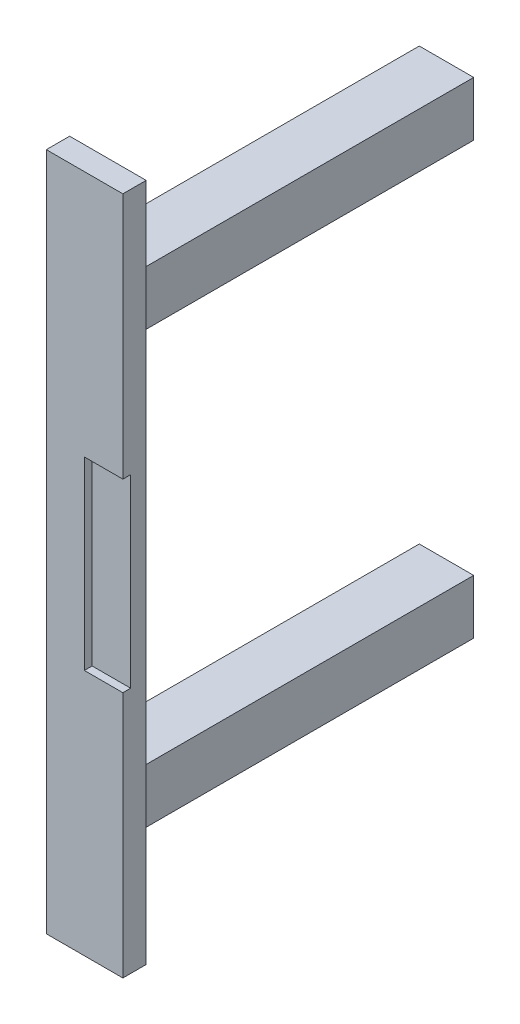
ISO-10303-21;
HEADER;
FILE_DESCRIPTION(('STEP AP214'),'2;1');
FILE_NAME('part.step','',(''),(''),'','','');
FILE_SCHEMA(('AUTOMOTIVE_DESIGN { 1 0 10303 214 1 1 1 1 }'));
ENDSEC;
DATA;
#1=APPLICATION_CONTEXT('core data for automotive mechanical design processes');
#2=APPLICATION_PROTOCOL_DEFINITION('international standard','automotive_design',2000,#1);
#3=PRODUCT_CONTEXT('',#1,'mechanical');
#4=PRODUCT('Part','Part','',(#3));
#5=PRODUCT_RELATED_PRODUCT_CATEGORY('part','',(#4));
#6=PRODUCT_DEFINITION_FORMATION('','',#4);
#7=PRODUCT_DEFINITION_CONTEXT('part definition',#1,'design');
#8=PRODUCT_DEFINITION('design','',#6,#7);
#9=PRODUCT_DEFINITION_SHAPE('','',#8);
#10=(LENGTH_UNIT() NAMED_UNIT(*) SI_UNIT(.MILLI.,.METRE.));
#11=(NAMED_UNIT(*) PLANE_ANGLE_UNIT() SI_UNIT($,.RADIAN.));
#12=(NAMED_UNIT(*) SI_UNIT($,.STERADIAN.) SOLID_ANGLE_UNIT());
#13=UNCERTAINTY_MEASURE_WITH_UNIT(LENGTH_MEASURE(1.E-05),#10,'distance_accuracy_value','');
#14=(GEOMETRIC_REPRESENTATION_CONTEXT(3) GLOBAL_UNCERTAINTY_ASSIGNED_CONTEXT((#13)) GLOBAL_UNIT_ASSIGNED_CONTEXT((#10,
#11,#12)) REPRESENTATION_CONTEXT('',''));
#15=CARTESIAN_POINT('',(0.,0.,0.));
#16=DIRECTION('',(0.,0.,1.));
#17=DIRECTION('',(1.,0.,0.));
#18=AXIS2_PLACEMENT_3D('',#15,#16,#17);
#19=CARTESIAN_POINT('',(-10.,174.8,-3.));
#20=DIRECTION('',(0.,0.,1.));
#21=DIRECTION('',(1.,0.,0.));
#22=AXIS2_PLACEMENT_3D('',#19,#20,#21);
#23=PLANE('',#22);
#24=DIRECTION('',(-1.,0.,0.));
#25=VECTOR('',#24,1.);
#26=CARTESIAN_POINT('',(-10.,174.8,-3.));
#27=LINE('',#26,#25);
#28=CARTESIAN_POINT('',(9.7,174.8,-3.));
#29=VERTEX_POINT('',#28);
#30=CARTESIAN_POINT('',(-10.,174.8,-3.));
#31=VERTEX_POINT('',#30);
#32=EDGE_CURVE('E182',#29,#31,#27,.T.);
#33=ORIENTED_EDGE('',*,*,#32,.F.);
#34=DIRECTION('',(0.,-1.,0.));
#35=VECTOR('',#34,1.);
#36=CARTESIAN_POINT('',(9.7,175.,-3.));
#37=LINE('',#36,#35);
#38=CARTESIAN_POINT('',(9.7,0.,-3.));
#39=VERTEX_POINT('',#38);
#40=EDGE_CURVE('E236',#29,#39,#37,.T.);
#41=ORIENTED_EDGE('',*,*,#40,.T.);
#42=DIRECTION('',(-1.,0.,0.));
#43=VECTOR('',#42,1.);
#44=CARTESIAN_POINT('',(-10.,0.,-3.));
#45=LINE('',#44,#43);
#46=CARTESIAN_POINT('',(-10.,0.,-3.));
#47=VERTEX_POINT('',#46);
#48=EDGE_CURVE('E173',#39,#47,#45,.T.);
#49=ORIENTED_EDGE('',*,*,#48,.T.);
#50=DIRECTION('',(0.,-1.,0.));
#51=VECTOR('',#50,1.);
#52=CARTESIAN_POINT('',(-10.,174.8,-3.));
#53=LINE('',#52,#51);
#54=CARTESIAN_POINT('',(-10.,24.9,-3.));
#55=VERTEX_POINT('',#54);
#56=EDGE_CURVE('E194',#55,#47,#53,.T.);
#57=ORIENTED_EDGE('',*,*,#56,.F.);
#58=DIRECTION('',(-1.,0.,0.));
#59=VECTOR('',#58,1.);
#60=CARTESIAN_POINT('',(-10.,24.9,-3.));
#61=LINE('',#60,#59);
#62=CARTESIAN_POINT('',(4.,24.9,-3.));
#63=VERTEX_POINT('',#62);
#64=EDGE_CURVE('E336',#63,#55,#61,.T.);
#65=ORIENTED_EDGE('',*,*,#64,.F.);
#66=DIRECTION('',(0.,-1.,0.));
#67=VECTOR('',#66,1.);
#68=CARTESIAN_POINT('',(4.,24.9,-3.));
#69=LINE('',#68,#67);
#70=CARTESIAN_POINT('',(4.,38.9,-3.));
#71=VERTEX_POINT('',#70);
#72=EDGE_CURVE('E255',#71,#63,#69,.T.);
#73=ORIENTED_EDGE('',*,*,#72,.F.);
#74=DIRECTION('',(1.,0.,0.));
#75=VECTOR('',#74,1.);
#76=CARTESIAN_POINT('',(-10.,38.9,-3.));
#77=LINE('',#76,#75);
#78=CARTESIAN_POINT('',(-10.,38.9,-3.));
#79=VERTEX_POINT('',#78);
#80=EDGE_CURVE('E253',#79,#71,#77,.T.);
#81=ORIENTED_EDGE('',*,*,#80,.F.);
#82=CARTESIAN_POINT('',(-10.,135.9,-3.));
#83=VERTEX_POINT('',#82);
#84=EDGE_CURVE('E199',#83,#79,#53,.T.);
#85=ORIENTED_EDGE('',*,*,#84,.F.);
#86=DIRECTION('',(1.,0.,0.));
#87=VECTOR('',#86,1.);
#88=CARTESIAN_POINT('',(-10.,135.9,-3.));
#89=LINE('',#88,#87);
#90=CARTESIAN_POINT('',(4.,135.9,-3.));
#91=VERTEX_POINT('',#90);
#92=EDGE_CURVE('E66',#83,#91,#89,.T.);
#93=ORIENTED_EDGE('',*,*,#92,.T.);
#94=DIRECTION('',(0.,1.,0.));
#95=VECTOR('',#94,1.);
#96=CARTESIAN_POINT('',(4.,149.9,-3.));
#97=LINE('',#96,#95);
#98=CARTESIAN_POINT('',(4.,149.9,-3.));
#99=VERTEX_POINT('',#98);
#100=EDGE_CURVE('E317',#91,#99,#97,.T.);
#101=ORIENTED_EDGE('',*,*,#100,.T.);
#102=DIRECTION('',(-1.,0.,0.));
#103=VECTOR('',#102,1.);
#104=CARTESIAN_POINT('',(-10.,149.9,-3.));
#105=LINE('',#104,#103);
#106=CARTESIAN_POINT('',(-10.,149.9,-3.));
#107=VERTEX_POINT('',#106);
#108=EDGE_CURVE('E298',#99,#107,#105,.T.);
#109=ORIENTED_EDGE('',*,*,#108,.T.);
#110=EDGE_CURVE('E196',#31,#107,#53,.T.);
#111=ORIENTED_EDGE('',*,*,#110,.F.);
#112=EDGE_LOOP('',(#33,#41,#49,#57,#65,#73,#81,#85,#93,#101,#109,#111));
#113=FACE_BOUND('',#112,.T.);
#114=ADVANCED_FACE('F44',(#113),#23,.F.);
#115=CARTESIAN_POINT('',(-10.,174.8,-3.));
#116=DIRECTION('',(1.,0.,0.));
#117=DIRECTION('',(0.,0.,-1.));
#118=AXIS2_PLACEMENT_3D('',#115,#116,#117);
#119=PLANE('',#118);
#120=DIRECTION('',(0.,0.,1.));
#121=VECTOR('',#120,1.);
#122=CARTESIAN_POINT('',(-10.,0.,-3.));
#123=LINE('',#122,#121);
#124=CARTESIAN_POINT('',(-10.,0.,3.));
#125=VERTEX_POINT('',#124);
#126=EDGE_CURVE('E183',#47,#125,#123,.T.);
#127=ORIENTED_EDGE('',*,*,#126,.T.);
#128=DIRECTION('',(0.,-1.,0.));
#129=VECTOR('',#128,1.);
#130=CARTESIAN_POINT('',(-10.,174.8,3.));
#131=LINE('',#130,#129);
#132=CARTESIAN_POINT('',(-10.,174.8,3.));
#133=VERTEX_POINT('',#132);
#134=EDGE_CURVE('E180',#133,#125,#131,.T.);
#135=ORIENTED_EDGE('',*,*,#134,.F.);
#136=DIRECTION('',(0.,0.,1.));
#137=VECTOR('',#136,1.);
#138=CARTESIAN_POINT('',(-10.,174.8,-3.));
#139=LINE('',#138,#137);
#140=EDGE_CURVE('E187',#31,#133,#139,.T.);
#141=ORIENTED_EDGE('',*,*,#140,.F.);
#142=ORIENTED_EDGE('',*,*,#110,.T.);
#143=DIRECTION('',(0.,0.,1.));
#144=VECTOR('',#143,1.);
#145=CARTESIAN_POINT('',(-10.,149.9,-93.));
#146=LINE('',#145,#144);
#147=CARTESIAN_POINT('',(-10.,149.9,-93.));
#148=VERTEX_POINT('',#147);
#149=EDGE_CURVE('E260',#148,#107,#146,.T.);
#150=ORIENTED_EDGE('',*,*,#149,.F.);
#151=DIRECTION('',(0.,-1.,0.));
#152=VECTOR('',#151,1.);
#153=CARTESIAN_POINT('',(-10.,149.9,-93.));
#154=LINE('',#153,#152);
#155=CARTESIAN_POINT('',(-10.,135.9,-93.));
#156=VERTEX_POINT('',#155);
#157=EDGE_CURVE('E299',#148,#156,#154,.T.);
#158=ORIENTED_EDGE('',*,*,#157,.T.);
#159=DIRECTION('',(0.,0.,1.));
#160=VECTOR('',#159,1.);
#161=CARTESIAN_POINT('',(-10.,135.9,-93.));
#162=LINE('',#161,#160);
#163=EDGE_CURVE('E251',#156,#83,#162,.T.);
#164=ORIENTED_EDGE('',*,*,#163,.T.);
#165=ORIENTED_EDGE('',*,*,#84,.T.);
#166=DIRECTION('',(0.,0.,1.));
#167=VECTOR('',#166,1.);
#168=CARTESIAN_POINT('',(-10.,38.9,-93.));
#169=LINE('',#168,#167);
#170=CARTESIAN_POINT('',(-10.,38.9,-93.));
#171=VERTEX_POINT('',#170);
#172=EDGE_CURVE('E249',#171,#79,#169,.T.);
#173=ORIENTED_EDGE('',*,*,#172,.F.);
#174=DIRECTION('',(0.,1.,0.));
#175=VECTOR('',#174,1.);
#176=CARTESIAN_POINT('',(-10.,24.9,-93.));
#177=LINE('',#176,#175);
#178=CARTESIAN_POINT('',(-10.,24.9,-93.));
#179=VERTEX_POINT('',#178);
#180=EDGE_CURVE('E333',#179,#171,#177,.T.);
#181=ORIENTED_EDGE('',*,*,#180,.F.);
#182=DIRECTION('',(0.,0.,1.));
#183=VECTOR('',#182,1.);
#184=CARTESIAN_POINT('',(-10.,24.9,-93.));
#185=LINE('',#184,#183);
#186=EDGE_CURVE('E242',#179,#55,#185,.T.);
#187=ORIENTED_EDGE('',*,*,#186,.T.);
#188=ORIENTED_EDGE('',*,*,#56,.T.);
#189=EDGE_LOOP('',(#127,#135,#141,#142,#150,#158,#164,#165,#173,#181,#187,#188));
#190=FACE_BOUND('',#189,.T.);
#191=ADVANCED_FACE('F239',(#190),#119,.F.);
#192=CARTESIAN_POINT('',(-10.,174.8,3.));
#193=DIRECTION('',(0.,0.,-1.));
#194=DIRECTION('',(-1.,0.,0.));
#195=AXIS2_PLACEMENT_3D('',#192,#193,#194);
#196=PLANE('',#195);
#197=DIRECTION('',(1.,0.,0.));
#198=VECTOR('',#197,1.);
#199=CARTESIAN_POINT('',(-10.,0.,3.));
#200=LINE('',#199,#198);
#201=CARTESIAN_POINT('',(9.7,0.,3.));
#202=VERTEX_POINT('',#201);
#203=EDGE_CURVE('E172',#125,#202,#200,.T.);
#204=ORIENTED_EDGE('',*,*,#203,.T.);
#205=DIRECTION('',(0.,-1.,0.));
#206=VECTOR('',#205,1.);
#207=CARTESIAN_POINT('',(9.7,175.,3.));
#208=LINE('',#207,#206);
#209=CARTESIAN_POINT('',(9.7,63.6,3.));
#210=VERTEX_POINT('',#209);
#211=EDGE_CURVE('E154',#210,#202,#208,.T.);
#212=ORIENTED_EDGE('',*,*,#211,.F.);
#213=DIRECTION('',(1.,0.,0.));
#214=VECTOR('',#213,1.);
#215=CARTESIAN_POINT('',(-0.200000000000004,63.6,3.));
#216=LINE('',#215,#214);
#217=CARTESIAN_POINT('',(-0.200000000000004,63.6,3.));
#218=VERTEX_POINT('',#217);
#219=EDGE_CURVE('E270',#218,#210,#216,.T.);
#220=ORIENTED_EDGE('',*,*,#219,.F.);
#221=DIRECTION('',(0.,-1.,0.));
#222=VECTOR('',#221,1.);
#223=CARTESIAN_POINT('',(-0.20000000000001,111.2,3.));
#224=LINE('',#223,#222);
#225=CARTESIAN_POINT('',(-0.20000000000001,111.2,3.));
#226=VERTEX_POINT('',#225);
#227=EDGE_CURVE('E205',#226,#218,#224,.T.);
#228=ORIENTED_EDGE('',*,*,#227,.F.);
#229=DIRECTION('',(1.,0.,0.));
#230=VECTOR('',#229,1.);
#231=CARTESIAN_POINT('',(-10.,111.2,3.));
#232=LINE('',#231,#230);
#233=CARTESIAN_POINT('',(9.7,111.2,3.));
#234=VERTEX_POINT('',#233);
#235=EDGE_CURVE('E52',#226,#234,#232,.T.);
#236=ORIENTED_EDGE('',*,*,#235,.T.);
#237=CARTESIAN_POINT('',(9.7,174.8,3.));
#238=VERTEX_POINT('',#237);
#239=EDGE_CURVE('E59',#238,#234,#208,.T.);
#240=ORIENTED_EDGE('',*,*,#239,.F.);
#241=DIRECTION('',(1.,0.,0.));
#242=VECTOR('',#241,1.);
#243=CARTESIAN_POINT('',(-10.,174.8,3.));
#244=LINE('',#243,#242);
#245=EDGE_CURVE('E195',#133,#238,#244,.T.);
#246=ORIENTED_EDGE('',*,*,#245,.F.);
#247=ORIENTED_EDGE('',*,*,#134,.T.);
#248=EDGE_LOOP('',(#204,#212,#220,#228,#236,#240,#246,#247));
#249=FACE_BOUND('',#248,.T.);
#250=ADVANCED_FACE('F177',(#249),#196,.F.);
#251=CARTESIAN_POINT('',(0.,174.8,0.));
#252=DIRECTION('',(0.,1.,0.));
#253=DIRECTION('',(0.,0.,1.));
#254=AXIS2_PLACEMENT_3D('',#251,#252,#253);
#255=PLANE('',#254);
#256=DIRECTION('',(0.,0.,1.));
#257=VECTOR('',#256,1.);
#258=CARTESIAN_POINT('',(9.7,174.8,0.));
#259=LINE('',#258,#257);
#260=EDGE_CURVE('E292',#29,#238,#259,.T.);
#261=ORIENTED_EDGE('',*,*,#260,.F.);
#262=ORIENTED_EDGE('',*,*,#32,.T.);
#263=ORIENTED_EDGE('',*,*,#140,.T.);
#264=ORIENTED_EDGE('',*,*,#245,.T.);
#265=EDGE_LOOP('',(#261,#262,#263,#264));
#266=FACE_BOUND('',#265,.T.);
#267=ADVANCED_FACE('F380',(#266),#255,.T.);
#268=CARTESIAN_POINT('',(0.,0.,0.));
#269=DIRECTION('',(0.,1.,0.));
#270=DIRECTION('',(0.,0.,1.));
#271=AXIS2_PLACEMENT_3D('',#268,#269,#270);
#272=PLANE('',#271);
#273=ORIENTED_EDGE('',*,*,#48,.F.);
#274=DIRECTION('',(0.,0.,-1.));
#275=VECTOR('',#274,1.);
#276=CARTESIAN_POINT('',(9.7,0.,-3.));
#277=LINE('',#276,#275);
#278=EDGE_CURVE('E157',#202,#39,#277,.T.);
#279=ORIENTED_EDGE('',*,*,#278,.F.);
#280=ORIENTED_EDGE('',*,*,#203,.F.);
#281=ORIENTED_EDGE('',*,*,#126,.F.);
#282=EDGE_LOOP('',(#273,#279,#280,#281));
#283=FACE_BOUND('',#282,.T.);
#284=ADVANCED_FACE('F170',(#283),#272,.F.);
#285=CARTESIAN_POINT('',(0.,0.,1.));
#286=DIRECTION('',(0.,0.,1.));
#287=DIRECTION('',(1.,0.,0.));
#288=AXIS2_PLACEMENT_3D('',#285,#286,#287);
#289=PLANE('',#288);
#290=DIRECTION('',(0.,-1.,0.));
#291=VECTOR('',#290,1.);
#292=CARTESIAN_POINT('',(9.7,0.,1.));
#293=LINE('',#292,#291);
#294=CARTESIAN_POINT('',(9.7,111.2,1.));
#295=VERTEX_POINT('',#294);
#296=CARTESIAN_POINT('',(9.7,63.6,1.));
#297=VERTEX_POINT('',#296);
#298=EDGE_CURVE('E287',#295,#297,#293,.T.);
#299=ORIENTED_EDGE('',*,*,#298,.F.);
#300=DIRECTION('',(-1.,0.,0.));
#301=VECTOR('',#300,1.);
#302=CARTESIAN_POINT('',(-0.20000000000001,111.2,1.));
#303=LINE('',#302,#301);
#304=CARTESIAN_POINT('',(-0.20000000000001,111.2,1.));
#305=VERTEX_POINT('',#304);
#306=EDGE_CURVE('E276',#295,#305,#303,.T.);
#307=ORIENTED_EDGE('',*,*,#306,.T.);
#308=DIRECTION('',(0.,-1.,0.));
#309=VECTOR('',#308,1.);
#310=CARTESIAN_POINT('',(-0.20000000000001,111.2,1.));
#311=LINE('',#310,#309);
#312=CARTESIAN_POINT('',(-0.200000000000004,63.6,1.));
#313=VERTEX_POINT('',#312);
#314=EDGE_CURVE('E216',#305,#313,#311,.T.);
#315=ORIENTED_EDGE('',*,*,#314,.T.);
#316=DIRECTION('',(1.,0.,0.));
#317=VECTOR('',#316,1.);
#318=CARTESIAN_POINT('',(-0.200000000000004,63.6,1.));
#319=LINE('',#318,#317);
#320=EDGE_CURVE('E219',#313,#297,#319,.T.);
#321=ORIENTED_EDGE('',*,*,#320,.T.);
#322=EDGE_LOOP('',(#299,#307,#315,#321));
#323=FACE_BOUND('',#322,.T.);
#324=ADVANCED_FACE('F286',(#323),#289,.T.);
#325=CARTESIAN_POINT('',(-0.200000000000004,63.6,1.));
#326=DIRECTION('',(0.,-1.,0.));
#327=DIRECTION('',(0.,0.,-1.));
#328=AXIS2_PLACEMENT_3D('',#325,#326,#327);
#329=PLANE('',#328);
#330=ORIENTED_EDGE('',*,*,#219,.T.);
#331=DIRECTION('',(0.,0.,-1.));
#332=VECTOR('',#331,1.);
#333=CARTESIAN_POINT('',(9.7,63.6,1.));
#334=LINE('',#333,#332);
#335=EDGE_CURVE('E160',#210,#297,#334,.T.);
#336=ORIENTED_EDGE('',*,*,#335,.T.);
#337=ORIENTED_EDGE('',*,*,#320,.F.);
#338=DIRECTION('',(0.,0.,1.));
#339=VECTOR('',#338,1.);
#340=CARTESIAN_POINT('',(-0.200000000000004,63.6,1.));
#341=LINE('',#340,#339);
#342=EDGE_CURVE('E218',#313,#218,#341,.T.);
#343=ORIENTED_EDGE('',*,*,#342,.T.);
#344=EDGE_LOOP('',(#330,#336,#337,#343));
#345=FACE_BOUND('',#344,.T.);
#346=ADVANCED_FACE('F282',(#345),#329,.F.);
#347=CARTESIAN_POINT('',(-0.20000000000001,111.2,1.));
#348=DIRECTION('',(0.,1.,0.));
#349=DIRECTION('',(0.,0.,1.));
#350=AXIS2_PLACEMENT_3D('',#347,#348,#349);
#351=PLANE('',#350);
#352=ORIENTED_EDGE('',*,*,#306,.F.);
#353=DIRECTION('',(0.,0.,1.));
#354=VECTOR('',#353,1.);
#355=CARTESIAN_POINT('',(9.7,111.2,1.));
#356=LINE('',#355,#354);
#357=EDGE_CURVE('E11',#295,#234,#356,.T.);
#358=ORIENTED_EDGE('',*,*,#357,.T.);
#359=ORIENTED_EDGE('',*,*,#235,.F.);
#360=DIRECTION('',(0.,0.,1.));
#361=VECTOR('',#360,1.);
#362=CARTESIAN_POINT('',(-0.20000000000001,111.2,1.));
#363=LINE('',#362,#361);
#364=EDGE_CURVE('E211',#305,#226,#363,.T.);
#365=ORIENTED_EDGE('',*,*,#364,.F.);
#366=EDGE_LOOP('',(#352,#358,#359,#365));
#367=FACE_BOUND('',#366,.T.);
#368=ADVANCED_FACE('F210',(#367),#351,.F.);
#369=CARTESIAN_POINT('',(-0.20000000000001,111.2,1.));
#370=DIRECTION('',(-1.,0.,0.));
#371=DIRECTION('',(0.,-1.,0.));
#372=AXIS2_PLACEMENT_3D('',#369,#370,#371);
#373=PLANE('',#372);
#374=ORIENTED_EDGE('',*,*,#227,.T.);
#375=ORIENTED_EDGE('',*,*,#342,.F.);
#376=ORIENTED_EDGE('',*,*,#314,.F.);
#377=ORIENTED_EDGE('',*,*,#364,.T.);
#378=EDGE_LOOP('',(#374,#375,#376,#377));
#379=FACE_BOUND('',#378,.T.);
#380=ADVANCED_FACE('F214',(#379),#373,.F.);
#381=CARTESIAN_POINT('',(-10.,38.9,-93.));
#382=DIRECTION('',(0.,-1.,0.));
#383=DIRECTION('',(0.,0.,-1.));
#384=AXIS2_PLACEMENT_3D('',#381,#382,#383);
#385=PLANE('',#384);
#386=ORIENTED_EDGE('',*,*,#80,.T.);
#387=DIRECTION('',(0.,0.,1.));
#388=VECTOR('',#387,1.);
#389=CARTESIAN_POINT('',(4.,38.9,-93.));
#390=LINE('',#389,#388);
#391=CARTESIAN_POINT('',(4.,38.9,-93.));
#392=VERTEX_POINT('',#391);
#393=EDGE_CURVE('E266',#392,#71,#390,.T.);
#394=ORIENTED_EDGE('',*,*,#393,.F.);
#395=DIRECTION('',(1.,0.,0.));
#396=VECTOR('',#395,1.);
#397=CARTESIAN_POINT('',(-10.,38.9,-93.));
#398=LINE('',#397,#396);
#399=EDGE_CURVE('E263',#171,#392,#398,.T.);
#400=ORIENTED_EDGE('',*,*,#399,.F.);
#401=ORIENTED_EDGE('',*,*,#172,.T.);
#402=EDGE_LOOP('',(#386,#394,#400,#401));
#403=FACE_BOUND('',#402,.T.);
#404=ADVANCED_FACE('F262',(#403),#385,.F.);
#405=CARTESIAN_POINT('',(4.,24.9,-93.));
#406=DIRECTION('',(-1.,0.,0.));
#407=DIRECTION('',(0.,0.,1.));
#408=AXIS2_PLACEMENT_3D('',#405,#406,#407);
#409=PLANE('',#408);
#410=ORIENTED_EDGE('',*,*,#72,.T.);
#411=DIRECTION('',(0.,0.,1.));
#412=VECTOR('',#411,1.);
#413=CARTESIAN_POINT('',(4.,24.9,-93.));
#414=LINE('',#413,#412);
#415=CARTESIAN_POINT('',(4.,24.9,-93.));
#416=VERTEX_POINT('',#415);
#417=EDGE_CURVE('E272',#416,#63,#414,.T.);
#418=ORIENTED_EDGE('',*,*,#417,.F.);
#419=DIRECTION('',(0.,-1.,0.));
#420=VECTOR('',#419,1.);
#421=CARTESIAN_POINT('',(4.,24.9,-93.));
#422=LINE('',#421,#420);
#423=EDGE_CURVE('E339',#392,#416,#422,.T.);
#424=ORIENTED_EDGE('',*,*,#423,.F.);
#425=ORIENTED_EDGE('',*,*,#393,.T.);
#426=EDGE_LOOP('',(#410,#418,#424,#425));
#427=FACE_BOUND('',#426,.T.);
#428=ADVANCED_FACE('F358',(#427),#409,.F.);
#429=CARTESIAN_POINT('',(-10.,24.9,-93.));
#430=DIRECTION('',(0.,1.,0.));
#431=DIRECTION('',(-1.,0.,0.));
#432=AXIS2_PLACEMENT_3D('',#429,#430,#431);
#433=PLANE('',#432);
#434=ORIENTED_EDGE('',*,*,#64,.T.);
#435=ORIENTED_EDGE('',*,*,#186,.F.);
#436=DIRECTION('',(-1.,0.,0.));
#437=VECTOR('',#436,1.);
#438=CARTESIAN_POINT('',(-10.,24.9,-93.));
#439=LINE('',#438,#437);
#440=EDGE_CURVE('E342',#416,#179,#439,.T.);
#441=ORIENTED_EDGE('',*,*,#440,.F.);
#442=ORIENTED_EDGE('',*,*,#417,.T.);
#443=EDGE_LOOP('',(#434,#435,#441,#442));
#444=FACE_BOUND('',#443,.T.);
#445=ADVANCED_FACE('F355',(#444),#433,.F.);
#446=CARTESIAN_POINT('',(0.,0.,-93.));
#447=DIRECTION('',(0.,0.,-1.));
#448=DIRECTION('',(-1.,0.,0.));
#449=AXIS2_PLACEMENT_3D('',#446,#447,#448);
#450=PLANE('',#449);
#451=ORIENTED_EDGE('',*,*,#180,.T.);
#452=ORIENTED_EDGE('',*,*,#399,.T.);
#453=ORIENTED_EDGE('',*,*,#423,.T.);
#454=ORIENTED_EDGE('',*,*,#440,.T.);
#455=EDGE_LOOP('',(#451,#452,#453,#454));
#456=FACE_BOUND('',#455,.T.);
#457=ADVANCED_FACE('F360',(#456),#450,.T.);
#458=CARTESIAN_POINT('',(-10.,149.9,-93.));
#459=DIRECTION('',(0.,1.,0.));
#460=DIRECTION('',(-1.,0.,0.));
#461=AXIS2_PLACEMENT_3D('',#458,#459,#460);
#462=PLANE('',#461);
#463=ORIENTED_EDGE('',*,*,#108,.F.);
#464=DIRECTION('',(0.,0.,1.));
#465=VECTOR('',#464,1.);
#466=CARTESIAN_POINT('',(4.,149.9,-93.));
#467=LINE('',#466,#465);
#468=CARTESIAN_POINT('',(4.,149.9,-93.));
#469=VERTEX_POINT('',#468);
#470=EDGE_CURVE('E328',#469,#99,#467,.T.);
#471=ORIENTED_EDGE('',*,*,#470,.F.);
#472=DIRECTION('',(-1.,0.,0.));
#473=VECTOR('',#472,1.);
#474=CARTESIAN_POINT('',(-10.,149.9,-93.));
#475=LINE('',#474,#473);
#476=EDGE_CURVE('E302',#469,#148,#475,.T.);
#477=ORIENTED_EDGE('',*,*,#476,.T.);
#478=ORIENTED_EDGE('',*,*,#149,.T.);
#479=EDGE_LOOP('',(#463,#471,#477,#478));
#480=FACE_BOUND('',#479,.T.);
#481=ADVANCED_FACE('F362',(#480),#462,.T.);
#482=CARTESIAN_POINT('',(4.,149.9,-93.));
#483=DIRECTION('',(1.,0.,0.));
#484=DIRECTION('',(0.,0.,-1.));
#485=AXIS2_PLACEMENT_3D('',#482,#483,#484);
#486=PLANE('',#485);
#487=ORIENTED_EDGE('',*,*,#100,.F.);
#488=DIRECTION('',(0.,0.,1.));
#489=VECTOR('',#488,1.);
#490=CARTESIAN_POINT('',(4.,135.9,-93.));
#491=LINE('',#490,#489);
#492=CARTESIAN_POINT('',(4.,135.9,-93.));
#493=VERTEX_POINT('',#492);
#494=EDGE_CURVE('E325',#493,#91,#491,.T.);
#495=ORIENTED_EDGE('',*,*,#494,.F.);
#496=DIRECTION('',(0.,1.,0.));
#497=VECTOR('',#496,1.);
#498=CARTESIAN_POINT('',(4.,149.9,-93.));
#499=LINE('',#498,#497);
#500=EDGE_CURVE('E306',#493,#469,#499,.T.);
#501=ORIENTED_EDGE('',*,*,#500,.T.);
#502=ORIENTED_EDGE('',*,*,#470,.T.);
#503=EDGE_LOOP('',(#487,#495,#501,#502));
#504=FACE_BOUND('',#503,.T.);
#505=ADVANCED_FACE('F369',(#504),#486,.T.);
#506=CARTESIAN_POINT('',(-10.,135.9,-93.));
#507=DIRECTION('',(0.,-1.,0.));
#508=DIRECTION('',(0.,0.,-1.));
#509=AXIS2_PLACEMENT_3D('',#506,#507,#508);
#510=PLANE('',#509);
#511=ORIENTED_EDGE('',*,*,#92,.F.);
#512=ORIENTED_EDGE('',*,*,#163,.F.);
#513=DIRECTION('',(1.,0.,0.));
#514=VECTOR('',#513,1.);
#515=CARTESIAN_POINT('',(-10.,135.9,-93.));
#516=LINE('',#515,#514);
#517=EDGE_CURVE('E310',#156,#493,#516,.T.);
#518=ORIENTED_EDGE('',*,*,#517,.T.);
#519=ORIENTED_EDGE('',*,*,#494,.T.);
#520=EDGE_LOOP('',(#511,#512,#518,#519));
#521=FACE_BOUND('',#520,.T.);
#522=ADVANCED_FACE('F435',(#521),#510,.T.);
#523=CARTESIAN_POINT('',(0.,174.8,-93.));
#524=DIRECTION('',(0.,0.,-1.));
#525=DIRECTION('',(-1.,0.,0.));
#526=AXIS2_PLACEMENT_3D('',#523,#524,#525);
#527=PLANE('',#526);
#528=ORIENTED_EDGE('',*,*,#157,.F.);
#529=ORIENTED_EDGE('',*,*,#476,.F.);
#530=ORIENTED_EDGE('',*,*,#500,.F.);
#531=ORIENTED_EDGE('',*,*,#517,.F.);
#532=EDGE_LOOP('',(#528,#529,#530,#531));
#533=FACE_BOUND('',#532,.T.);
#534=ADVANCED_FACE('F445',(#533),#527,.T.);
#535=CARTESIAN_POINT('',(9.7,175.,-3.));
#536=DIRECTION('',(-1.,0.,0.));
#537=DIRECTION('',(0.,0.,1.));
#538=AXIS2_PLACEMENT_3D('',#535,#536,#537);
#539=PLANE('',#538);
#540=ORIENTED_EDGE('',*,*,#260,.T.);
#541=ORIENTED_EDGE('',*,*,#239,.T.);
#542=ORIENTED_EDGE('',*,*,#357,.F.);
#543=ORIENTED_EDGE('',*,*,#298,.T.);
#544=ORIENTED_EDGE('',*,*,#335,.F.);
#545=ORIENTED_EDGE('',*,*,#211,.T.);
#546=ORIENTED_EDGE('',*,*,#278,.T.);
#547=ORIENTED_EDGE('',*,*,#40,.F.);
#548=EDGE_LOOP('',(#540,#541,#542,#543,#544,#545,#546,#547));
#549=FACE_BOUND('',#548,.T.);
#550=ADVANCED_FACE('F156',(#549),#539,.F.);
#551=CLOSED_SHELL('',(#114,#191,#250,#267,#284,#324,#346,#368,#380,#404,#428,#445,#457,#481,
#505,#522,#534,#550));
#552=MANIFOLD_SOLID_BREP('B2',#551);
#553=ADVANCED_BREP_SHAPE_REPRESENTATION('',(#18,#552),#14);
#554=SHAPE_DEFINITION_REPRESENTATION(#9,#553);
ENDSEC;
END-ISO-10303-21;
